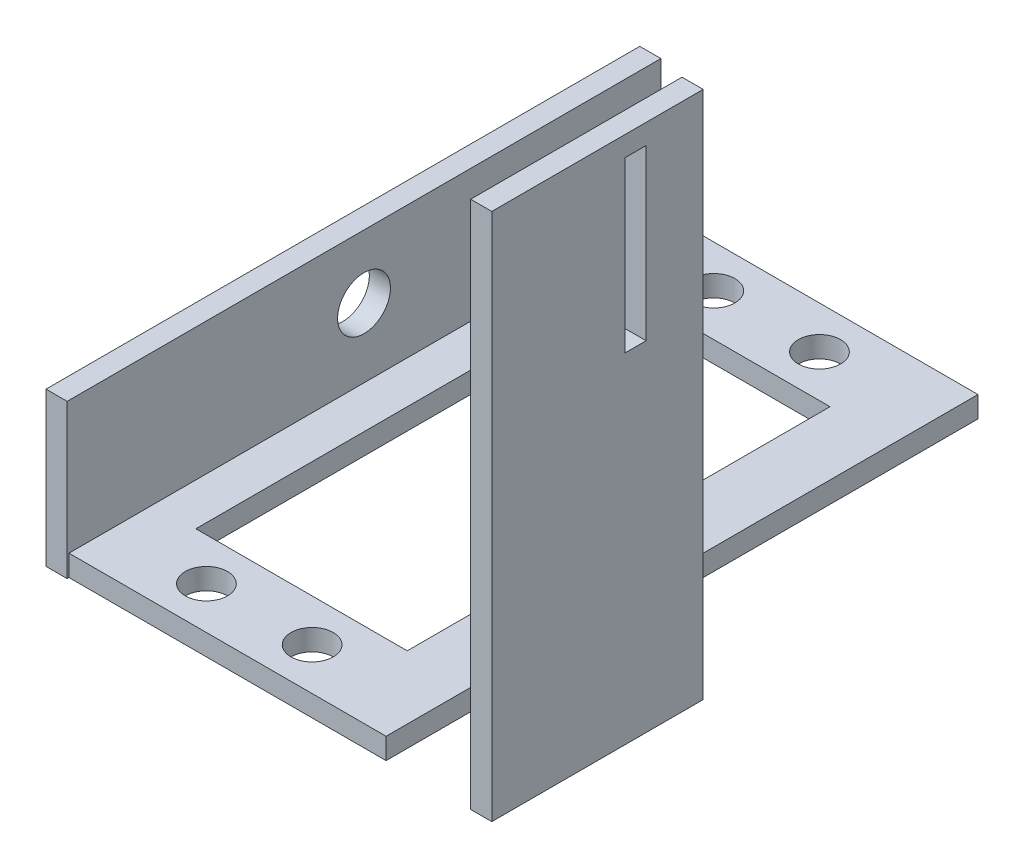
ISO-10303-21;
HEADER;
FILE_DESCRIPTION(('STEP AP214'),'2;1');
FILE_NAME('part.step','',(''),(''),'','','');
FILE_SCHEMA(('AUTOMOTIVE_DESIGN { 1 0 10303 214 1 1 1 1 }'));
ENDSEC;
DATA;
#1=APPLICATION_CONTEXT('core data for automotive mechanical design processes');
#2=APPLICATION_PROTOCOL_DEFINITION('international standard','automotive_design',2000,#1);
#3=PRODUCT_CONTEXT('',#1,'mechanical');
#4=PRODUCT('Part','Part','',(#3));
#5=PRODUCT_RELATED_PRODUCT_CATEGORY('part','',(#4));
#6=PRODUCT_DEFINITION_FORMATION('','',#4);
#7=PRODUCT_DEFINITION_CONTEXT('part definition',#1,'design');
#8=PRODUCT_DEFINITION('design','',#6,#7);
#9=PRODUCT_DEFINITION_SHAPE('','',#8);
#10=(LENGTH_UNIT() NAMED_UNIT(*) SI_UNIT(.MILLI.,.METRE.));
#11=(NAMED_UNIT(*) PLANE_ANGLE_UNIT() SI_UNIT($,.RADIAN.));
#12=(NAMED_UNIT(*) SI_UNIT($,.STERADIAN.) SOLID_ANGLE_UNIT());
#13=UNCERTAINTY_MEASURE_WITH_UNIT(LENGTH_MEASURE(1.E-05),#10,'distance_accuracy_value','');
#14=(GEOMETRIC_REPRESENTATION_CONTEXT(3) GLOBAL_UNCERTAINTY_ASSIGNED_CONTEXT((#13)) GLOBAL_UNIT_ASSIGNED_CONTEXT((#10,
#11,#12)) REPRESENTATION_CONTEXT('',''));
#15=CARTESIAN_POINT('',(0.,0.,0.));
#16=DIRECTION('',(0.,0.,1.));
#17=DIRECTION('',(1.,0.,0.));
#18=AXIS2_PLACEMENT_3D('',#15,#16,#17);
#19=CARTESIAN_POINT('',(15.6140938336516,0.,0.));
#20=DIRECTION('',(1.,0.,0.));
#21=DIRECTION('',(0.,0.,-1.));
#22=AXIS2_PLACEMENT_3D('',#19,#20,#21);
#23=PLANE('',#22);
#24=DIRECTION('',(0.,-1.,0.));
#25=VECTOR('',#24,1.);
#26=CARTESIAN_POINT('',(15.6140938336516,42.,11.5013167120157));
#27=LINE('',#26,#25);
#28=CARTESIAN_POINT('',(15.6140938336516,2.,11.5013167120157));
#29=VERTEX_POINT('',#28);
#30=CARTESIAN_POINT('',(15.6140938336516,0.,11.5013167120157));
#31=VERTEX_POINT('',#30);
#32=EDGE_CURVE('E11',#29,#31,#27,.T.);
#33=ORIENTED_EDGE('',*,*,#32,.F.);
#34=DIRECTION('',(0.,0.,1.));
#35=VECTOR('',#34,1.);
#36=CARTESIAN_POINT('',(15.6140938336516,2.,19.5013167120157));
#37=LINE('',#36,#35);
#38=CARTESIAN_POINT('',(15.6140938336516,2.,19.5013167120157));
#39=VERTEX_POINT('',#38);
#40=EDGE_CURVE('E347',#29,#39,#37,.T.);
#41=ORIENTED_EDGE('',*,*,#40,.T.);
#42=DIRECTION('',(0.,-1.,0.));
#43=VECTOR('',#42,1.);
#44=CARTESIAN_POINT('',(15.6140938336516,2.,19.5013167120157));
#45=LINE('',#44,#43);
#46=CARTESIAN_POINT('',(15.6140938336516,0.,19.5013167120157));
#47=VERTEX_POINT('',#46);
#48=EDGE_CURVE('E338',#39,#47,#45,.T.);
#49=ORIENTED_EDGE('',*,*,#48,.T.);
#50=DIRECTION('',(0.,0.,-1.));
#51=VECTOR('',#50,1.);
#52=CARTESIAN_POINT('',(15.6140938336516,0.,19.5013167120157));
#53=LINE('',#52,#51);
#54=EDGE_CURVE('E342',#47,#31,#53,.T.);
#55=ORIENTED_EDGE('',*,*,#54,.T.);
#56=EDGE_LOOP('',(#33,#41,#49,#55));
#57=FACE_BOUND('',#56,.T.);
#58=ADVANCED_FACE('F32',(#57),#23,.T.);
#59=CARTESIAN_POINT('',(9.61409383365159,0.,0.));
#60=DIRECTION('',(1.,0.,0.));
#61=DIRECTION('',(0.,0.,-1.));
#62=AXIS2_PLACEMENT_3D('',#59,#60,#61);
#63=PLANE('',#62);
#64=DIRECTION('',(0.,-1.,0.));
#65=VECTOR('',#64,1.);
#66=CARTESIAN_POINT('',(9.61409383365159,2.,-28.4986832879843));
#67=LINE('',#66,#65);
#68=CARTESIAN_POINT('',(9.61409383365159,2.,-28.4986832879843));
#69=VERTEX_POINT('',#68);
#70=CARTESIAN_POINT('',(9.61409383365159,0.,-28.4986832879843));
#71=VERTEX_POINT('',#70);
#72=EDGE_CURVE('E330',#69,#71,#67,.T.);
#73=ORIENTED_EDGE('',*,*,#72,.T.);
#74=DIRECTION('',(0.,0.,-1.));
#75=VECTOR('',#74,1.);
#76=CARTESIAN_POINT('',(9.61409383365159,0.,19.5013167120157));
#77=LINE('',#76,#75);
#78=CARTESIAN_POINT('',(9.61409383365159,0.,11.5013167120157));
#79=VERTEX_POINT('',#78);
#80=EDGE_CURVE('E337',#79,#71,#77,.T.);
#81=ORIENTED_EDGE('',*,*,#80,.F.);
#82=DIRECTION('',(0.,-1.,0.));
#83=VECTOR('',#82,1.);
#84=CARTESIAN_POINT('',(9.61409383365159,2.,11.5013167120157));
#85=LINE('',#84,#83);
#86=CARTESIAN_POINT('',(9.61409383365159,2.,11.5013167120157));
#87=VERTEX_POINT('',#86);
#88=EDGE_CURVE('E374',#87,#79,#85,.T.);
#89=ORIENTED_EDGE('',*,*,#88,.F.);
#90=DIRECTION('',(0.,0.,1.));
#91=VECTOR('',#90,1.);
#92=CARTESIAN_POINT('',(9.61409383365159,2.,19.5013167120157));
#93=LINE('',#92,#91);
#94=EDGE_CURVE('E291',#69,#87,#93,.T.);
#95=ORIENTED_EDGE('',*,*,#94,.F.);
#96=EDGE_LOOP('',(#73,#81,#89,#95));
#97=FACE_BOUND('',#96,.T.);
#98=ADVANCED_FACE('F399',(#97),#63,.F.);
#99=CARTESIAN_POINT('',(0.,2.,0.));
#100=DIRECTION('',(0.,1.,0.));
#101=DIRECTION('',(0.,0.,1.));
#102=AXIS2_PLACEMENT_3D('',#99,#100,#101);
#103=PLANE('',#102);
#104=DIRECTION('',(0.,0.,-1.));
#105=VECTOR('',#104,1.);
#106=CARTESIAN_POINT('',(-14.3859061663484,2.,-36.4986832879843));
#107=LINE('',#106,#105);
#108=CARTESIAN_POINT('',(-14.3859061663484,2.,19.5013167120157));
#109=VERTEX_POINT('',#108);
#110=CARTESIAN_POINT('',(-14.3859061663484,2.,-36.4986832879843));
#111=VERTEX_POINT('',#110);
#112=EDGE_CURVE('E285',#109,#111,#107,.T.);
#113=ORIENTED_EDGE('',*,*,#112,.F.);
#114=DIRECTION('',(1.,0.,0.));
#115=VECTOR('',#114,1.);
#116=CARTESIAN_POINT('',(-10.3859061663484,2.,19.5013167120157));
#117=LINE('',#116,#115);
#118=EDGE_CURVE('E367',#109,#39,#117,.T.);
#119=ORIENTED_EDGE('',*,*,#118,.T.);
#120=ORIENTED_EDGE('',*,*,#40,.F.);
#121=CARTESIAN_POINT('',(15.6140938336516,2.,-8.4986832879843));
#122=VERTEX_POINT('',#121);
#123=EDGE_CURVE('E349',#122,#29,#37,.T.);
#124=ORIENTED_EDGE('',*,*,#123,.F.);
#125=CARTESIAN_POINT('',(15.6140938336516,2.,-36.4986832879843));
#126=VERTEX_POINT('',#125);
#127=EDGE_CURVE('E297',#126,#122,#37,.T.);
#128=ORIENTED_EDGE('',*,*,#127,.F.);
#129=DIRECTION('',(-1.,0.,0.));
#130=VECTOR('',#129,1.);
#131=CARTESIAN_POINT('',(15.6140938336516,2.,-36.4986832879843));
#132=LINE('',#131,#130);
#133=EDGE_CURVE('E294',#126,#111,#132,.T.);
#134=ORIENTED_EDGE('',*,*,#133,.T.);
#135=EDGE_LOOP('',(#113,#119,#120,#124,#128,#134));
#136=FACE_BOUND('',#135,.T.);
#137=CARTESIAN_POINT('',(4.61409383365159,2.,15.5013167120157));
#138=DIRECTION('',(0.,1.,0.));
#139=DIRECTION('',(0.,0.,1.));
#140=AXIS2_PLACEMENT_3D('',#137,#138,#139);
#141=CIRCLE('',#140,2.);
#142=CARTESIAN_POINT('',(4.61409383365159,2.,17.5013167120157));
#143=VERTEX_POINT('',#142);
#144=EDGE_CURVE('E303',#143,#143,#141,.T.);
#145=ORIENTED_EDGE('',*,*,#144,.F.);
#146=EDGE_LOOP('',(#145));
#147=FACE_BOUND('',#146,.T.);
#148=DIRECTION('',(-1.,0.,0.));
#149=VECTOR('',#148,1.);
#150=CARTESIAN_POINT('',(-10.3859061663484,2.,11.5013167120157));
#151=LINE('',#150,#149);
#152=CARTESIAN_POINT('',(-10.3859061663484,2.,11.5013167120157));
#153=VERTEX_POINT('',#152);
#154=EDGE_CURVE('E370',#87,#153,#151,.T.);
#155=ORIENTED_EDGE('',*,*,#154,.T.);
#156=DIRECTION('',(0.,0.,-1.));
#157=VECTOR('',#156,1.);
#158=CARTESIAN_POINT('',(-10.3859061663484,2.,-36.4986832879843));
#159=LINE('',#158,#157);
#160=CARTESIAN_POINT('',(-10.3859061663484,2.,-28.4986832879843));
#161=VERTEX_POINT('',#160);
#162=EDGE_CURVE('E306',#153,#161,#159,.T.);
#163=ORIENTED_EDGE('',*,*,#162,.T.);
#164=DIRECTION('',(1.,0.,0.));
#165=VECTOR('',#164,1.);
#166=CARTESIAN_POINT('',(-10.3859061663484,2.,-28.4986832879843));
#167=LINE('',#166,#165);
#168=EDGE_CURVE('E328',#161,#69,#167,.T.);
#169=ORIENTED_EDGE('',*,*,#168,.T.);
#170=ORIENTED_EDGE('',*,*,#94,.T.);
#171=EDGE_LOOP('',(#155,#163,#169,#170));
#172=FACE_BOUND('',#171,.T.);
#173=CARTESIAN_POINT('',(-5.38590616634841,2.,15.5013167120157));
#174=DIRECTION('',(0.,1.,0.));
#175=DIRECTION('',(0.,0.,1.));
#176=AXIS2_PLACEMENT_3D('',#173,#174,#175);
#177=CIRCLE('',#176,2.);
#178=CARTESIAN_POINT('',(-5.38590616634841,2.,17.5013167120157));
#179=VERTEX_POINT('',#178);
#180=EDGE_CURVE('E356',#179,#179,#177,.T.);
#181=ORIENTED_EDGE('',*,*,#180,.F.);
#182=EDGE_LOOP('',(#181));
#183=FACE_BOUND('',#182,.T.);
#184=CARTESIAN_POINT('',(4.61409383365159,2.,-32.4986832879843));
#185=DIRECTION('',(0.,1.,0.));
#186=DIRECTION('',(0.,0.,1.));
#187=AXIS2_PLACEMENT_3D('',#184,#185,#186);
#188=CIRCLE('',#187,2.);
#189=CARTESIAN_POINT('',(4.61409383365159,2.,-30.4986832879843));
#190=VERTEX_POINT('',#189);
#191=EDGE_CURVE('E322',#190,#190,#188,.T.);
#192=ORIENTED_EDGE('',*,*,#191,.F.);
#193=EDGE_LOOP('',(#192));
#194=FACE_BOUND('',#193,.T.);
#195=CARTESIAN_POINT('',(-5.38590616634841,2.,-32.4986832879843));
#196=DIRECTION('',(0.,1.,0.));
#197=DIRECTION('',(0.,0.,1.));
#198=AXIS2_PLACEMENT_3D('',#195,#196,#197);
#199=CIRCLE('',#198,2.);
#200=CARTESIAN_POINT('',(-5.38590616634841,2.,-30.4986832879843));
#201=VERTEX_POINT('',#200);
#202=EDGE_CURVE('E316',#201,#201,#199,.T.);
#203=ORIENTED_EDGE('',*,*,#202,.F.);
#204=EDGE_LOOP('',(#203));
#205=FACE_BOUND('',#204,.T.);
#206=ADVANCED_FACE('F385',(#136,#147,#172,#183,#194,#205),#103,.T.);
#207=CARTESIAN_POINT('',(0.,0.,0.));
#208=DIRECTION('',(0.,1.,0.));
#209=DIRECTION('',(0.,0.,1.));
#210=AXIS2_PLACEMENT_3D('',#207,#208,#209);
#211=PLANE('',#210);
#212=DIRECTION('',(1.,0.,0.));
#213=VECTOR('',#212,1.);
#214=CARTESIAN_POINT('',(-10.3859061663484,0.,19.5013167120157));
#215=LINE('',#214,#213);
#216=CARTESIAN_POINT('',(-14.3859061663484,0.,19.5013167120157));
#217=VERTEX_POINT('',#216);
#218=EDGE_CURVE('E300',#217,#47,#215,.T.);
#219=ORIENTED_EDGE('',*,*,#218,.F.);
#220=DIRECTION('',(0.,0.,1.));
#221=VECTOR('',#220,1.);
#222=CARTESIAN_POINT('',(-14.3859061663484,0.,-36.4986832879843));
#223=LINE('',#222,#221);
#224=CARTESIAN_POINT('',(-14.3859061663484,0.,19.6765111813875));
#225=VERTEX_POINT('',#224);
#226=EDGE_CURVE('E275',#217,#225,#223,.T.);
#227=ORIENTED_EDGE('',*,*,#226,.T.);
#228=DIRECTION('',(1.,0.,0.));
#229=VECTOR('',#228,1.);
#230=CARTESIAN_POINT('',(-16.3859061663484,0.,19.6765111813875));
#231=LINE('',#230,#229);
#232=CARTESIAN_POINT('',(-16.3859061663484,0.,19.6765111813875));
#233=VERTEX_POINT('',#232);
#234=EDGE_CURVE('E276',#233,#225,#231,.T.);
#235=ORIENTED_EDGE('',*,*,#234,.F.);
#236=DIRECTION('',(0.,0.,1.));
#237=VECTOR('',#236,1.);
#238=CARTESIAN_POINT('',(-16.3859061663484,0.,-36.4986832879843));
#239=LINE('',#238,#237);
#240=CARTESIAN_POINT('',(-16.3859061663484,0.,-36.4986832879843));
#241=VERTEX_POINT('',#240);
#242=EDGE_CURVE('E259',#241,#233,#239,.T.);
#243=ORIENTED_EDGE('',*,*,#242,.F.);
#244=DIRECTION('',(-1.,0.,0.));
#245=VECTOR('',#244,1.);
#246=CARTESIAN_POINT('',(15.6140938336516,0.,-36.4986832879843));
#247=LINE('',#246,#245);
#248=CARTESIAN_POINT('',(15.6140938336516,0.,-36.4986832879843));
#249=VERTEX_POINT('',#248);
#250=EDGE_CURVE('E296',#249,#241,#247,.T.);
#251=ORIENTED_EDGE('',*,*,#250,.F.);
#252=CARTESIAN_POINT('',(15.6140938336516,0.,-8.4986832879843));
#253=VERTEX_POINT('',#252);
#254=EDGE_CURVE('E341',#253,#249,#53,.T.);
#255=ORIENTED_EDGE('',*,*,#254,.F.);
#256=EDGE_CURVE('E345',#31,#253,#53,.T.);
#257=ORIENTED_EDGE('',*,*,#256,.F.);
#258=ORIENTED_EDGE('',*,*,#54,.F.);
#259=EDGE_LOOP('',(#219,#227,#235,#243,#251,#255,#257,#258));
#260=FACE_BOUND('',#259,.T.);
#261=DIRECTION('',(0.,0.,1.));
#262=VECTOR('',#261,1.);
#263=CARTESIAN_POINT('',(-10.3859061663484,0.,-36.4986832879843));
#264=LINE('',#263,#262);
#265=CARTESIAN_POINT('',(-10.3859061663484,0.,-28.4986832879843));
#266=VERTEX_POINT('',#265);
#267=CARTESIAN_POINT('',(-10.3859061663484,0.,11.5013167120157));
#268=VERTEX_POINT('',#267);
#269=EDGE_CURVE('E282',#266,#268,#264,.T.);
#270=ORIENTED_EDGE('',*,*,#269,.T.);
#271=DIRECTION('',(-1.,0.,0.));
#272=VECTOR('',#271,1.);
#273=CARTESIAN_POINT('',(-10.3859061663484,0.,11.5013167120157));
#274=LINE('',#273,#272);
#275=EDGE_CURVE('E302',#79,#268,#274,.T.);
#276=ORIENTED_EDGE('',*,*,#275,.F.);
#277=ORIENTED_EDGE('',*,*,#80,.T.);
#278=DIRECTION('',(1.,0.,0.));
#279=VECTOR('',#278,1.);
#280=CARTESIAN_POINT('',(-10.3859061663484,0.,-28.4986832879843));
#281=LINE('',#280,#279);
#282=EDGE_CURVE('E325',#266,#71,#281,.T.);
#283=ORIENTED_EDGE('',*,*,#282,.F.);
#284=EDGE_LOOP('',(#270,#276,#277,#283));
#285=FACE_BOUND('',#284,.T.);
#286=CARTESIAN_POINT('',(4.61409383365159,0.,15.5013167120157));
#287=DIRECTION('',(0.,1.,0.));
#288=DIRECTION('',(0.,0.,1.));
#289=AXIS2_PLACEMENT_3D('',#286,#287,#288);
#290=CIRCLE('',#289,2.);
#291=CARTESIAN_POINT('',(4.61409383365159,0.,17.5013167120157));
#292=VERTEX_POINT('',#291);
#293=EDGE_CURVE('E359',#292,#292,#290,.T.);
#294=ORIENTED_EDGE('',*,*,#293,.T.);
#295=EDGE_LOOP('',(#294));
#296=FACE_BOUND('',#295,.T.);
#297=CARTESIAN_POINT('',(-5.38590616634841,0.,15.5013167120157));
#298=DIRECTION('',(0.,1.,0.));
#299=DIRECTION('',(0.,0.,1.));
#300=AXIS2_PLACEMENT_3D('',#297,#298,#299);
#301=CIRCLE('',#300,2.);
#302=CARTESIAN_POINT('',(-5.38590616634841,0.,17.5013167120157));
#303=VERTEX_POINT('',#302);
#304=EDGE_CURVE('E360',#303,#303,#301,.T.);
#305=ORIENTED_EDGE('',*,*,#304,.T.);
#306=EDGE_LOOP('',(#305));
#307=FACE_BOUND('',#306,.T.);
#308=CARTESIAN_POINT('',(4.61409383365159,0.,-32.4986832879843));
#309=DIRECTION('',(0.,1.,0.));
#310=DIRECTION('',(0.,0.,1.));
#311=AXIS2_PLACEMENT_3D('',#308,#309,#310);
#312=CIRCLE('',#311,2.);
#313=CARTESIAN_POINT('',(4.61409383365159,0.,-30.4986832879843));
#314=VERTEX_POINT('',#313);
#315=EDGE_CURVE('E319',#314,#314,#312,.T.);
#316=ORIENTED_EDGE('',*,*,#315,.T.);
#317=EDGE_LOOP('',(#316));
#318=FACE_BOUND('',#317,.T.);
#319=CARTESIAN_POINT('',(-5.38590616634841,0.,-32.4986832879843));
#320=DIRECTION('',(0.,1.,0.));
#321=DIRECTION('',(0.,0.,1.));
#322=AXIS2_PLACEMENT_3D('',#319,#320,#321);
#323=CIRCLE('',#322,2.);
#324=CARTESIAN_POINT('',(-5.38590616634841,0.,-30.4986832879843));
#325=VERTEX_POINT('',#324);
#326=EDGE_CURVE('E289',#325,#325,#323,.T.);
#327=ORIENTED_EDGE('',*,*,#326,.T.);
#328=EDGE_LOOP('',(#327));
#329=FACE_BOUND('',#328,.T.);
#330=ADVANCED_FACE('F401',(#260,#285,#296,#307,#318,#329),#211,.F.);
#331=CARTESIAN_POINT('',(-10.3859061663484,2.,19.5013167120157));
#332=DIRECTION('',(0.,0.,-1.));
#333=DIRECTION('',(-1.,0.,0.));
#334=AXIS2_PLACEMENT_3D('',#331,#332,#333);
#335=PLANE('',#334);
#336=ORIENTED_EDGE('',*,*,#218,.T.);
#337=ORIENTED_EDGE('',*,*,#48,.F.);
#338=ORIENTED_EDGE('',*,*,#118,.F.);
#339=DIRECTION('',(0.,1.,0.));
#340=VECTOR('',#339,1.);
#341=CARTESIAN_POINT('',(-14.3859061663484,2.,19.5013167120157));
#342=LINE('',#341,#340);
#343=EDGE_CURVE('E290',#217,#109,#342,.T.);
#344=ORIENTED_EDGE('',*,*,#343,.F.);
#345=EDGE_LOOP('',(#336,#337,#338,#344));
#346=FACE_BOUND('',#345,.T.);
#347=ADVANCED_FACE('F34',(#346),#335,.F.);
#348=CARTESIAN_POINT('',(-10.3859061663484,2.,11.5013167120157));
#349=DIRECTION('',(0.,0.,1.));
#350=DIRECTION('',(1.,0.,0.));
#351=AXIS2_PLACEMENT_3D('',#348,#349,#350);
#352=PLANE('',#351);
#353=ORIENTED_EDGE('',*,*,#275,.T.);
#354=DIRECTION('',(0.,-1.,0.));
#355=VECTOR('',#354,1.);
#356=CARTESIAN_POINT('',(-10.3859061663484,2.,11.5013167120157));
#357=LINE('',#356,#355);
#358=EDGE_CURVE('E371',#153,#268,#357,.T.);
#359=ORIENTED_EDGE('',*,*,#358,.F.);
#360=ORIENTED_EDGE('',*,*,#154,.F.);
#361=ORIENTED_EDGE('',*,*,#88,.T.);
#362=EDGE_LOOP('',(#353,#359,#360,#361));
#363=FACE_BOUND('',#362,.T.);
#364=ADVANCED_FACE('F390',(#363),#352,.F.);
#365=CARTESIAN_POINT('',(4.61409383365159,2.,15.5013167120157));
#366=DIRECTION('',(0.,-1.,0.));
#367=DIRECTION('',(0.,0.,-1.));
#368=AXIS2_PLACEMENT_3D('',#365,#366,#367);
#369=CYLINDRICAL_SURFACE('',#368,2.);
#370=ORIENTED_EDGE('',*,*,#144,.T.);
#371=EDGE_LOOP('',(#370));
#372=FACE_BOUND('',#371,.T.);
#373=ORIENTED_EDGE('',*,*,#293,.F.);
#374=EDGE_LOOP('',(#373));
#375=FACE_BOUND('',#374,.T.);
#376=ADVANCED_FACE('F447',(#372,#375),#369,.F.);
#377=CARTESIAN_POINT('',(-5.38590616634841,2.,15.5013167120157));
#378=DIRECTION('',(0.,-1.,0.));
#379=DIRECTION('',(0.,0.,-1.));
#380=AXIS2_PLACEMENT_3D('',#377,#378,#379);
#381=CYLINDRICAL_SURFACE('',#380,2.);
#382=ORIENTED_EDGE('',*,*,#180,.T.);
#383=EDGE_LOOP('',(#382));
#384=FACE_BOUND('',#383,.T.);
#385=ORIENTED_EDGE('',*,*,#304,.F.);
#386=EDGE_LOOP('',(#385));
#387=FACE_BOUND('',#386,.T.);
#388=ADVANCED_FACE('F441',(#384,#387),#381,.F.);
#389=CARTESIAN_POINT('',(15.6140938336516,2.,-36.4986832879843));
#390=DIRECTION('',(0.,0.,1.));
#391=DIRECTION('',(1.,0.,0.));
#392=AXIS2_PLACEMENT_3D('',#389,#390,#391);
#393=PLANE('',#392);
#394=ORIENTED_EDGE('',*,*,#250,.T.);
#395=DIRECTION('',(0.,-1.,0.));
#396=VECTOR('',#395,1.);
#397=CARTESIAN_POINT('',(-16.3859061663484,0.,-36.4986832879843));
#398=LINE('',#397,#396);
#399=CARTESIAN_POINT('',(-16.3859061663484,14.5283077447971,-36.4986832879843));
#400=VERTEX_POINT('',#399);
#401=EDGE_CURVE('E256',#400,#241,#398,.T.);
#402=ORIENTED_EDGE('',*,*,#401,.F.);
#403=DIRECTION('',(1.,0.,0.));
#404=VECTOR('',#403,1.);
#405=CARTESIAN_POINT('',(-16.3859061663484,14.5283077447971,-36.4986832879843));
#406=LINE('',#405,#404);
#407=CARTESIAN_POINT('',(-14.3859061663484,14.5283077447971,-36.4986832879843));
#408=VERTEX_POINT('',#407);
#409=EDGE_CURVE('E266',#400,#408,#406,.T.);
#410=ORIENTED_EDGE('',*,*,#409,.T.);
#411=DIRECTION('',(0.,-1.,0.));
#412=VECTOR('',#411,1.);
#413=CARTESIAN_POINT('',(-14.3859061663484,0.,-36.4986832879843));
#414=LINE('',#413,#412);
#415=EDGE_CURVE('E253',#408,#111,#414,.T.);
#416=ORIENTED_EDGE('',*,*,#415,.T.);
#417=ORIENTED_EDGE('',*,*,#133,.F.);
#418=DIRECTION('',(0.,1.,0.));
#419=VECTOR('',#418,1.);
#420=CARTESIAN_POINT('',(15.6140938336516,2.,-36.4986832879843));
#421=LINE('',#420,#419);
#422=EDGE_CURVE('E344',#249,#126,#421,.T.);
#423=ORIENTED_EDGE('',*,*,#422,.F.);
#424=EDGE_LOOP('',(#394,#402,#410,#416,#417,#423));
#425=FACE_BOUND('',#424,.T.);
#426=ADVANCED_FACE('F436',(#425),#393,.F.);
#427=DIRECTION('',(0.,1.,0.));
#428=VECTOR('',#427,1.);
#429=CARTESIAN_POINT('',(15.6140938336516,42.,-8.4986832879843));
#430=LINE('',#429,#428);
#431=EDGE_CURVE('E41',#253,#122,#430,.T.);
#432=ORIENTED_EDGE('',*,*,#431,.F.);
#433=ORIENTED_EDGE('',*,*,#254,.T.);
#434=ORIENTED_EDGE('',*,*,#422,.T.);
#435=ORIENTED_EDGE('',*,*,#127,.T.);
#436=EDGE_LOOP('',(#432,#433,#434,#435));
#437=FACE_BOUND('',#436,.T.);
#438=ADVANCED_FACE('F429',(#437),#23,.T.);
#439=CARTESIAN_POINT('',(-10.3859061663484,2.,-28.4986832879843));
#440=DIRECTION('',(0.,0.,-1.));
#441=DIRECTION('',(-1.,0.,0.));
#442=AXIS2_PLACEMENT_3D('',#439,#440,#441);
#443=PLANE('',#442);
#444=ORIENTED_EDGE('',*,*,#282,.T.);
#445=ORIENTED_EDGE('',*,*,#72,.F.);
#446=ORIENTED_EDGE('',*,*,#168,.F.);
#447=DIRECTION('',(0.,-1.,0.));
#448=VECTOR('',#447,1.);
#449=CARTESIAN_POINT('',(-10.3859061663484,2.,-28.4986832879843));
#450=LINE('',#449,#448);
#451=EDGE_CURVE('E334',#161,#266,#450,.T.);
#452=ORIENTED_EDGE('',*,*,#451,.T.);
#453=EDGE_LOOP('',(#444,#445,#446,#452));
#454=FACE_BOUND('',#453,.T.);
#455=ADVANCED_FACE('F396',(#454),#443,.F.);
#456=CARTESIAN_POINT('',(4.61409383365159,2.,-32.4986832879843));
#457=DIRECTION('',(0.,-1.,0.));
#458=DIRECTION('',(0.,0.,-1.));
#459=AXIS2_PLACEMENT_3D('',#456,#457,#458);
#460=CYLINDRICAL_SURFACE('',#459,2.);
#461=ORIENTED_EDGE('',*,*,#191,.T.);
#462=EDGE_LOOP('',(#461));
#463=FACE_BOUND('',#462,.T.);
#464=ORIENTED_EDGE('',*,*,#315,.F.);
#465=EDGE_LOOP('',(#464));
#466=FACE_BOUND('',#465,.T.);
#467=ADVANCED_FACE('F416',(#463,#466),#460,.F.);
#468=CARTESIAN_POINT('',(-5.38590616634841,2.,-32.4986832879843));
#469=DIRECTION('',(0.,-1.,0.));
#470=DIRECTION('',(0.,0.,-1.));
#471=AXIS2_PLACEMENT_3D('',#468,#469,#470);
#472=CYLINDRICAL_SURFACE('',#471,2.);
#473=ORIENTED_EDGE('',*,*,#202,.T.);
#474=EDGE_LOOP('',(#473));
#475=FACE_BOUND('',#474,.T.);
#476=ORIENTED_EDGE('',*,*,#326,.F.);
#477=EDGE_LOOP('',(#476));
#478=FACE_BOUND('',#477,.T.);
#479=ADVANCED_FACE('F414',(#475,#478),#472,.F.);
#480=CARTESIAN_POINT('',(-10.3859061663484,0.,0.));
#481=DIRECTION('',(-1.,0.,0.));
#482=DIRECTION('',(0.,0.,1.));
#483=AXIS2_PLACEMENT_3D('',#480,#481,#482);
#484=PLANE('',#483);
#485=ORIENTED_EDGE('',*,*,#162,.F.);
#486=ORIENTED_EDGE('',*,*,#358,.T.);
#487=ORIENTED_EDGE('',*,*,#269,.F.);
#488=ORIENTED_EDGE('',*,*,#451,.F.);
#489=EDGE_LOOP('',(#485,#486,#487,#488));
#490=FACE_BOUND('',#489,.T.);
#491=ADVANCED_FACE('F393',(#490),#484,.F.);
#492=CARTESIAN_POINT('',(-16.3859061663484,0.,19.6765111813875));
#493=DIRECTION('',(0.,0.,-1.));
#494=DIRECTION('',(-1.,0.,0.));
#495=AXIS2_PLACEMENT_3D('',#492,#493,#494);
#496=PLANE('',#495);
#497=DIRECTION('',(0.,1.,0.));
#498=VECTOR('',#497,1.);
#499=CARTESIAN_POINT('',(-14.3859061663484,0.,19.6765111813875));
#500=LINE('',#499,#498);
#501=CARTESIAN_POINT('',(-14.3859061663484,14.5283077447971,19.6765111813875));
#502=VERTEX_POINT('',#501);
#503=EDGE_CURVE('E279',#225,#502,#500,.T.);
#504=ORIENTED_EDGE('',*,*,#503,.T.);
#505=DIRECTION('',(1.,0.,0.));
#506=VECTOR('',#505,1.);
#507=CARTESIAN_POINT('',(-16.3859061663484,14.5283077447971,19.6765111813875));
#508=LINE('',#507,#506);
#509=CARTESIAN_POINT('',(-16.3859061663484,14.5283077447971,19.6765111813875));
#510=VERTEX_POINT('',#509);
#511=EDGE_CURVE('E482',#510,#502,#508,.T.);
#512=ORIENTED_EDGE('',*,*,#511,.F.);
#513=DIRECTION('',(0.,1.,0.));
#514=VECTOR('',#513,1.);
#515=CARTESIAN_POINT('',(-16.3859061663484,0.,19.6765111813875));
#516=LINE('',#515,#514);
#517=EDGE_CURVE('E262',#233,#510,#516,.T.);
#518=ORIENTED_EDGE('',*,*,#517,.F.);
#519=ORIENTED_EDGE('',*,*,#234,.T.);
#520=EDGE_LOOP('',(#504,#512,#518,#519));
#521=FACE_BOUND('',#520,.T.);
#522=ADVANCED_FACE('F423',(#521),#496,.F.);
#523=CARTESIAN_POINT('',(-16.3859061663484,14.5283077447971,-36.4986832879843));
#524=DIRECTION('',(0.,-1.,0.));
#525=DIRECTION('',(0.,0.,-1.));
#526=AXIS2_PLACEMENT_3D('',#523,#524,#525);
#527=PLANE('',#526);
#528=DIRECTION('',(0.,0.,-1.));
#529=VECTOR('',#528,1.);
#530=CARTESIAN_POINT('',(-14.3859061663484,14.5283077447971,-36.4986832879843));
#531=LINE('',#530,#529);
#532=EDGE_CURVE('E260',#502,#408,#531,.T.);
#533=ORIENTED_EDGE('',*,*,#532,.T.);
#534=ORIENTED_EDGE('',*,*,#409,.F.);
#535=DIRECTION('',(0.,0.,-1.));
#536=VECTOR('',#535,1.);
#537=CARTESIAN_POINT('',(-16.3859061663484,14.5283077447971,-36.4986832879843));
#538=LINE('',#537,#536);
#539=EDGE_CURVE('E264',#510,#400,#538,.T.);
#540=ORIENTED_EDGE('',*,*,#539,.F.);
#541=ORIENTED_EDGE('',*,*,#511,.T.);
#542=EDGE_LOOP('',(#533,#534,#540,#541));
#543=FACE_BOUND('',#542,.T.);
#544=ADVANCED_FACE('F492',(#543),#527,.F.);
#545=CARTESIAN_POINT('',(-16.3859061663484,0.,0.));
#546=DIRECTION('',(1.,0.,0.));
#547=DIRECTION('',(0.,0.,-1.));
#548=AXIS2_PLACEMENT_3D('',#545,#546,#547);
#549=PLANE('',#548);
#550=CARTESIAN_POINT('',(-16.3859061663484,8.52830774479708,-8.41108605329842));
#551=DIRECTION('',(-1.,0.,0.));
#552=DIRECTION('',(0.,0.,1.));
#553=AXIS2_PLACEMENT_3D('',#550,#551,#552);
#554=CIRCLE('',#553,2.5);
#555=CARTESIAN_POINT('',(-16.3859061663484,8.52830774479708,-5.91108605329842));
#556=VERTEX_POINT('',#555);
#557=EDGE_CURVE('E249',#556,#556,#554,.T.);
#558=ORIENTED_EDGE('',*,*,#557,.F.);
#559=EDGE_LOOP('',(#558));
#560=FACE_BOUND('',#559,.T.);
#561=ORIENTED_EDGE('',*,*,#401,.T.);
#562=ORIENTED_EDGE('',*,*,#242,.T.);
#563=ORIENTED_EDGE('',*,*,#517,.T.);
#564=ORIENTED_EDGE('',*,*,#539,.T.);
#565=EDGE_LOOP('',(#561,#562,#563,#564));
#566=FACE_BOUND('',#565,.T.);
#567=ADVANCED_FACE('F494',(#560,#566),#549,.F.);
#568=CARTESIAN_POINT('',(-14.3859061663484,0.,0.));
#569=DIRECTION('',(1.,0.,0.));
#570=DIRECTION('',(0.,0.,-1.));
#571=AXIS2_PLACEMENT_3D('',#568,#569,#570);
#572=PLANE('',#571);
#573=CARTESIAN_POINT('',(-14.3859061663484,8.52830774479708,-8.41108605329842));
#574=DIRECTION('',(-1.,0.,0.));
#575=DIRECTION('',(0.,0.,1.));
#576=AXIS2_PLACEMENT_3D('',#573,#574,#575);
#577=CIRCLE('',#576,2.5);
#578=CARTESIAN_POINT('',(-14.3859061663484,8.52830774479708,-5.91108605329842));
#579=VERTEX_POINT('',#578);
#580=EDGE_CURVE('E250',#579,#579,#577,.T.);
#581=ORIENTED_EDGE('',*,*,#580,.T.);
#582=EDGE_LOOP('',(#581));
#583=FACE_BOUND('',#582,.T.);
#584=ORIENTED_EDGE('',*,*,#226,.F.);
#585=ORIENTED_EDGE('',*,*,#343,.T.);
#586=ORIENTED_EDGE('',*,*,#112,.T.);
#587=ORIENTED_EDGE('',*,*,#415,.F.);
#588=ORIENTED_EDGE('',*,*,#532,.F.);
#589=ORIENTED_EDGE('',*,*,#503,.F.);
#590=EDGE_LOOP('',(#584,#585,#586,#587,#588,#589));
#591=FACE_BOUND('',#590,.T.);
#592=ADVANCED_FACE('F474',(#583,#591),#572,.T.);
#593=CARTESIAN_POINT('',(-14.3859061663484,8.52830774479708,-8.41108605329842));
#594=DIRECTION('',(-1.,0.,0.));
#595=DIRECTION('',(0.,0.,1.));
#596=AXIS2_PLACEMENT_3D('',#593,#594,#595);
#597=CYLINDRICAL_SURFACE('',#596,2.5);
#598=ORIENTED_EDGE('',*,*,#580,.F.);
#599=EDGE_LOOP('',(#598));
#600=FACE_BOUND('',#599,.T.);
#601=ORIENTED_EDGE('',*,*,#557,.T.);
#602=EDGE_LOOP('',(#601));
#603=FACE_BOUND('',#602,.T.);
#604=ADVANCED_FACE('F535',(#600,#603),#597,.F.);
#605=CARTESIAN_POINT('',(15.6140938336516,0.,0.));
#606=DIRECTION('',(1.,0.,0.));
#607=DIRECTION('',(0.,0.,-1.));
#608=AXIS2_PLACEMENT_3D('',#605,#606,#607);
#609=PLANE('',#608);
#610=CARTESIAN_POINT('',(15.6140938336516,-8.,11.5013167120157));
#611=VERTEX_POINT('',#610);
#612=EDGE_CURVE('E44',#31,#611,#27,.T.);
#613=ORIENTED_EDGE('',*,*,#612,.F.);
#614=ORIENTED_EDGE('',*,*,#256,.T.);
#615=CARTESIAN_POINT('',(15.6140938336516,-8.,-8.49868328798431));
#616=VERTEX_POINT('',#615);
#617=EDGE_CURVE('E234',#616,#253,#430,.T.);
#618=ORIENTED_EDGE('',*,*,#617,.F.);
#619=DIRECTION('',(0.,0.,-1.));
#620=VECTOR('',#619,1.);
#621=CARTESIAN_POINT('',(15.6140938336516,-8.,11.5013167120157));
#622=LINE('',#621,#620);
#623=EDGE_CURVE('E231',#611,#616,#622,.T.);
#624=ORIENTED_EDGE('',*,*,#623,.F.);
#625=EDGE_LOOP('',(#613,#614,#618,#624));
#626=FACE_BOUND('',#625,.T.);
#627=ADVANCED_FACE('F499',(#626),#609,.F.);
#628=DIRECTION('',(0.,-1.,0.));
#629=VECTOR('',#628,1.);
#630=CARTESIAN_POINT('',(15.6140938336516,24.102958265325,-1.10225408999043));
#631=LINE('',#630,#629);
#632=CARTESIAN_POINT('',(15.6140938336516,40.102958265325,-1.10225408999043));
#633=VERTEX_POINT('',#632);
#634=CARTESIAN_POINT('',(15.6140938336516,24.102958265325,-1.10225408999043));
#635=VERTEX_POINT('',#634);
#636=EDGE_CURVE('E207',#633,#635,#631,.T.);
#637=ORIENTED_EDGE('',*,*,#636,.T.);
#638=DIRECTION('',(0.,0.,-1.));
#639=VECTOR('',#638,1.);
#640=CARTESIAN_POINT('',(15.6140938336516,24.102958265325,-1.10225408999043));
#641=LINE('',#640,#639);
#642=CARTESIAN_POINT('',(15.6140938336516,24.102958265325,-3.10225408999043));
#643=VERTEX_POINT('',#642);
#644=EDGE_CURVE('E195',#635,#643,#641,.T.);
#645=ORIENTED_EDGE('',*,*,#644,.T.);
#646=DIRECTION('',(0.,1.,0.));
#647=VECTOR('',#646,1.);
#648=CARTESIAN_POINT('',(15.6140938336516,24.102958265325,-3.10225408999043));
#649=LINE('',#648,#647);
#650=CARTESIAN_POINT('',(15.6140938336516,40.102958265325,-3.10225408999043));
#651=VERTEX_POINT('',#650);
#652=EDGE_CURVE('E210',#643,#651,#649,.T.);
#653=ORIENTED_EDGE('',*,*,#652,.T.);
#654=DIRECTION('',(0.,0.,1.));
#655=VECTOR('',#654,1.);
#656=CARTESIAN_POINT('',(15.6140938336516,40.102958265325,-1.10225408999043));
#657=LINE('',#656,#655);
#658=EDGE_CURVE('E189',#651,#633,#657,.T.);
#659=ORIENTED_EDGE('',*,*,#658,.T.);
#660=EDGE_LOOP('',(#637,#645,#653,#659));
#661=FACE_BOUND('',#660,.T.);
#662=CARTESIAN_POINT('',(15.6140938336516,42.,-8.4986832879843));
#663=VERTEX_POINT('',#662);
#664=EDGE_CURVE('E233',#122,#663,#430,.T.);
#665=ORIENTED_EDGE('',*,*,#664,.F.);
#666=ORIENTED_EDGE('',*,*,#123,.T.);
#667=CARTESIAN_POINT('',(15.6140938336516,42.,11.5013167120157));
#668=VERTEX_POINT('',#667);
#669=EDGE_CURVE('E43',#668,#29,#27,.T.);
#670=ORIENTED_EDGE('',*,*,#669,.F.);
#671=DIRECTION('',(0.,0.,1.));
#672=VECTOR('',#671,1.);
#673=CARTESIAN_POINT('',(15.6140938336516,42.,11.5013167120157));
#674=LINE('',#673,#672);
#675=EDGE_CURVE('E223',#663,#668,#674,.T.);
#676=ORIENTED_EDGE('',*,*,#675,.F.);
#677=EDGE_LOOP('',(#665,#666,#670,#676));
#678=FACE_BOUND('',#677,.T.);
#679=ADVANCED_FACE('F517',(#661,#678),#609,.F.);
#680=CARTESIAN_POINT('',(17.6140938336516,0.,0.));
#681=DIRECTION('',(1.,0.,0.));
#682=DIRECTION('',(0.,0.,-1.));
#683=AXIS2_PLACEMENT_3D('',#680,#681,#682);
#684=PLANE('',#683);
#685=DIRECTION('',(0.,-1.,0.));
#686=VECTOR('',#685,1.);
#687=CARTESIAN_POINT('',(17.6140938336516,42.,11.5013167120157));
#688=LINE('',#687,#686);
#689=CARTESIAN_POINT('',(17.6140938336516,42.,11.5013167120157));
#690=VERTEX_POINT('',#689);
#691=CARTESIAN_POINT('',(17.6140938336516,-8.,11.5013167120157));
#692=VERTEX_POINT('',#691);
#693=EDGE_CURVE('E219',#690,#692,#688,.T.);
#694=ORIENTED_EDGE('',*,*,#693,.T.);
#695=DIRECTION('',(0.,0.,-1.));
#696=VECTOR('',#695,1.);
#697=CARTESIAN_POINT('',(17.6140938336516,-8.,11.5013167120157));
#698=LINE('',#697,#696);
#699=CARTESIAN_POINT('',(17.6140938336516,-8.,-8.49868328798431));
#700=VERTEX_POINT('',#699);
#701=EDGE_CURVE('E222',#692,#700,#698,.T.);
#702=ORIENTED_EDGE('',*,*,#701,.T.);
#703=DIRECTION('',(0.,1.,0.));
#704=VECTOR('',#703,1.);
#705=CARTESIAN_POINT('',(17.6140938336516,42.,-8.4986832879843));
#706=LINE('',#705,#704);
#707=CARTESIAN_POINT('',(17.6140938336516,42.,-8.4986832879843));
#708=VERTEX_POINT('',#707);
#709=EDGE_CURVE('E225',#700,#708,#706,.T.);
#710=ORIENTED_EDGE('',*,*,#709,.T.);
#711=DIRECTION('',(0.,0.,1.));
#712=VECTOR('',#711,1.);
#713=CARTESIAN_POINT('',(17.6140938336516,42.,11.5013167120157));
#714=LINE('',#713,#712);
#715=EDGE_CURVE('E227',#708,#690,#714,.T.);
#716=ORIENTED_EDGE('',*,*,#715,.T.);
#717=EDGE_LOOP('',(#694,#702,#710,#716));
#718=FACE_BOUND('',#717,.T.);
#719=DIRECTION('',(0.,0.,-1.));
#720=VECTOR('',#719,1.);
#721=CARTESIAN_POINT('',(17.6140938336516,24.102958265325,-1.10225408999043));
#722=LINE('',#721,#720);
#723=CARTESIAN_POINT('',(17.6140938336516,24.102958265325,-1.10225408999043));
#724=VERTEX_POINT('',#723);
#725=CARTESIAN_POINT('',(17.6140938336516,24.102958265325,-3.10225408999043));
#726=VERTEX_POINT('',#725);
#727=EDGE_CURVE('E188',#724,#726,#722,.T.);
#728=ORIENTED_EDGE('',*,*,#727,.F.);
#729=DIRECTION('',(0.,-1.,0.));
#730=VECTOR('',#729,1.);
#731=CARTESIAN_POINT('',(17.6140938336516,24.102958265325,-1.10225408999043));
#732=LINE('',#731,#730);
#733=CARTESIAN_POINT('',(17.6140938336516,40.102958265325,-1.10225408999043));
#734=VERTEX_POINT('',#733);
#735=EDGE_CURVE('E178',#734,#724,#732,.T.);
#736=ORIENTED_EDGE('',*,*,#735,.F.);
#737=DIRECTION('',(0.,0.,1.));
#738=VECTOR('',#737,1.);
#739=CARTESIAN_POINT('',(17.6140938336516,40.102958265325,-1.10225408999043));
#740=LINE('',#739,#738);
#741=CARTESIAN_POINT('',(17.6140938336516,40.102958265325,-3.10225408999043));
#742=VERTEX_POINT('',#741);
#743=EDGE_CURVE('E203',#742,#734,#740,.T.);
#744=ORIENTED_EDGE('',*,*,#743,.F.);
#745=DIRECTION('',(0.,1.,0.));
#746=VECTOR('',#745,1.);
#747=CARTESIAN_POINT('',(17.6140938336516,24.102958265325,-3.10225408999043));
#748=LINE('',#747,#746);
#749=EDGE_CURVE('E201',#726,#742,#748,.T.);
#750=ORIENTED_EDGE('',*,*,#749,.F.);
#751=EDGE_LOOP('',(#728,#736,#744,#750));
#752=FACE_BOUND('',#751,.T.);
#753=ADVANCED_FACE('F199',(#718,#752),#684,.T.);
#754=CARTESIAN_POINT('',(17.6140938336516,42.,11.5013167120157));
#755=DIRECTION('',(0.,0.,-1.));
#756=DIRECTION('',(0.,1.,0.));
#757=AXIS2_PLACEMENT_3D('',#754,#755,#756);
#758=PLANE('',#757);
#759=ORIENTED_EDGE('',*,*,#669,.T.);
#760=ORIENTED_EDGE('',*,*,#32,.T.);
#761=ORIENTED_EDGE('',*,*,#612,.T.);
#762=DIRECTION('',(-1.,0.,0.));
#763=VECTOR('',#762,1.);
#764=CARTESIAN_POINT('',(17.6140938336516,-8.,11.5013167120157));
#765=LINE('',#764,#763);
#766=EDGE_CURVE('E246',#692,#611,#765,.T.);
#767=ORIENTED_EDGE('',*,*,#766,.F.);
#768=ORIENTED_EDGE('',*,*,#693,.F.);
#769=DIRECTION('',(-1.,0.,0.));
#770=VECTOR('',#769,1.);
#771=CARTESIAN_POINT('',(17.6140938336516,42.,11.5013167120157));
#772=LINE('',#771,#770);
#773=EDGE_CURVE('E228',#690,#668,#772,.T.);
#774=ORIENTED_EDGE('',*,*,#773,.T.);
#775=EDGE_LOOP('',(#759,#760,#761,#767,#768,#774));
#776=FACE_BOUND('',#775,.T.);
#777=ADVANCED_FACE('F511',(#776),#758,.F.);
#778=CARTESIAN_POINT('',(17.6140938336516,-8.,11.5013167120157));
#779=DIRECTION('',(0.,1.,0.));
#780=DIRECTION('',(0.,0.,1.));
#781=AXIS2_PLACEMENT_3D('',#778,#779,#780);
#782=PLANE('',#781);
#783=ORIENTED_EDGE('',*,*,#623,.T.);
#784=DIRECTION('',(-1.,0.,0.));
#785=VECTOR('',#784,1.);
#786=CARTESIAN_POINT('',(17.6140938336516,-8.,-8.49868328798431));
#787=LINE('',#786,#785);
#788=EDGE_CURVE('E243',#700,#616,#787,.T.);
#789=ORIENTED_EDGE('',*,*,#788,.F.);
#790=ORIENTED_EDGE('',*,*,#701,.F.);
#791=ORIENTED_EDGE('',*,*,#766,.T.);
#792=EDGE_LOOP('',(#783,#789,#790,#791));
#793=FACE_BOUND('',#792,.T.);
#794=ADVANCED_FACE('F507',(#793),#782,.F.);
#795=CARTESIAN_POINT('',(17.6140938336516,42.,-8.4986832879843));
#796=DIRECTION('',(0.,0.,1.));
#797=DIRECTION('',(0.,-1.,0.));
#798=AXIS2_PLACEMENT_3D('',#795,#796,#797);
#799=PLANE('',#798);
#800=ORIENTED_EDGE('',*,*,#617,.T.);
#801=ORIENTED_EDGE('',*,*,#431,.T.);
#802=ORIENTED_EDGE('',*,*,#664,.T.);
#803=DIRECTION('',(-1.,0.,0.));
#804=VECTOR('',#803,1.);
#805=CARTESIAN_POINT('',(17.6140938336516,42.,-8.4986832879843));
#806=LINE('',#805,#804);
#807=EDGE_CURVE('E240',#708,#663,#806,.T.);
#808=ORIENTED_EDGE('',*,*,#807,.F.);
#809=ORIENTED_EDGE('',*,*,#709,.F.);
#810=ORIENTED_EDGE('',*,*,#788,.T.);
#811=EDGE_LOOP('',(#800,#801,#802,#808,#809,#810));
#812=FACE_BOUND('',#811,.T.);
#813=ADVANCED_FACE('F502',(#812),#799,.F.);
#814=CARTESIAN_POINT('',(17.6140938336516,42.,11.5013167120157));
#815=DIRECTION('',(0.,-1.,0.));
#816=DIRECTION('',(0.,0.,-1.));
#817=AXIS2_PLACEMENT_3D('',#814,#815,#816);
#818=PLANE('',#817);
#819=ORIENTED_EDGE('',*,*,#675,.T.);
#820=ORIENTED_EDGE('',*,*,#773,.F.);
#821=ORIENTED_EDGE('',*,*,#715,.F.);
#822=ORIENTED_EDGE('',*,*,#807,.T.);
#823=EDGE_LOOP('',(#819,#820,#821,#822));
#824=FACE_BOUND('',#823,.T.);
#825=ADVANCED_FACE('F520',(#824),#818,.F.);
#826=CARTESIAN_POINT('',(17.6140938336516,24.102958265325,-1.10225408999043));
#827=DIRECTION('',(0.,0.,-1.));
#828=DIRECTION('',(-1.,0.,0.));
#829=AXIS2_PLACEMENT_3D('',#826,#827,#828);
#830=PLANE('',#829);
#831=ORIENTED_EDGE('',*,*,#636,.F.);
#832=DIRECTION('',(-1.,0.,0.));
#833=VECTOR('',#832,1.);
#834=CARTESIAN_POINT('',(17.6140938336516,40.102958265325,-1.10225408999043));
#835=LINE('',#834,#833);
#836=EDGE_CURVE('E184',#734,#633,#835,.T.);
#837=ORIENTED_EDGE('',*,*,#836,.F.);
#838=ORIENTED_EDGE('',*,*,#735,.T.);
#839=DIRECTION('',(-1.,0.,0.));
#840=VECTOR('',#839,1.);
#841=CARTESIAN_POINT('',(17.6140938336516,24.102958265325,-1.10225408999043));
#842=LINE('',#841,#840);
#843=EDGE_CURVE('E181',#724,#635,#842,.T.);
#844=ORIENTED_EDGE('',*,*,#843,.T.);
#845=EDGE_LOOP('',(#831,#837,#838,#844));
#846=FACE_BOUND('',#845,.T.);
#847=ADVANCED_FACE('F180',(#846),#830,.T.);
#848=CARTESIAN_POINT('',(17.6140938336516,24.102958265325,-1.10225408999043));
#849=DIRECTION('',(0.,1.,0.));
#850=DIRECTION('',(0.,0.,1.));
#851=AXIS2_PLACEMENT_3D('',#848,#849,#850);
#852=PLANE('',#851);
#853=ORIENTED_EDGE('',*,*,#644,.F.);
#854=ORIENTED_EDGE('',*,*,#843,.F.);
#855=ORIENTED_EDGE('',*,*,#727,.T.);
#856=DIRECTION('',(-1.,0.,0.));
#857=VECTOR('',#856,1.);
#858=CARTESIAN_POINT('',(17.6140938336516,24.102958265325,-3.10225408999043));
#859=LINE('',#858,#857);
#860=EDGE_CURVE('E196',#726,#643,#859,.T.);
#861=ORIENTED_EDGE('',*,*,#860,.T.);
#862=EDGE_LOOP('',(#853,#854,#855,#861));
#863=FACE_BOUND('',#862,.T.);
#864=ADVANCED_FACE('F192',(#863),#852,.T.);
#865=CARTESIAN_POINT('',(17.6140938336516,24.102958265325,-3.10225408999043));
#866=DIRECTION('',(0.,0.,1.));
#867=DIRECTION('',(1.,0.,0.));
#868=AXIS2_PLACEMENT_3D('',#865,#866,#867);
#869=PLANE('',#868);
#870=ORIENTED_EDGE('',*,*,#652,.F.);
#871=ORIENTED_EDGE('',*,*,#860,.F.);
#872=ORIENTED_EDGE('',*,*,#749,.T.);
#873=DIRECTION('',(-1.,0.,0.));
#874=VECTOR('',#873,1.);
#875=CARTESIAN_POINT('',(17.6140938336516,40.102958265325,-3.10225408999043));
#876=LINE('',#875,#874);
#877=EDGE_CURVE('E216',#742,#651,#876,.T.);
#878=ORIENTED_EDGE('',*,*,#877,.T.);
#879=EDGE_LOOP('',(#870,#871,#872,#878));
#880=FACE_BOUND('',#879,.T.);
#881=ADVANCED_FACE('F626',(#880),#869,.T.);
#882=CARTESIAN_POINT('',(17.6140938336516,40.102958265325,-1.10225408999043));
#883=DIRECTION('',(0.,-1.,0.));
#884=DIRECTION('',(0.,0.,-1.));
#885=AXIS2_PLACEMENT_3D('',#882,#883,#884);
#886=PLANE('',#885);
#887=ORIENTED_EDGE('',*,*,#658,.F.);
#888=ORIENTED_EDGE('',*,*,#877,.F.);
#889=ORIENTED_EDGE('',*,*,#743,.T.);
#890=ORIENTED_EDGE('',*,*,#836,.T.);
#891=EDGE_LOOP('',(#887,#888,#889,#890));
#892=FACE_BOUND('',#891,.T.);
#893=ADVANCED_FACE('F634',(#892),#886,.T.);
#894=CLOSED_SHELL('',(#58,#98,#206,#330,#347,#364,#376,#388,#426,#438,#455,#467,#479,#491,#522,
#544,#567,#592,#604,#627,#679,#753,#777,#794,#813,#825,#847,#864,#881,#893));
#895=MANIFOLD_SOLID_BREP('B2',#894);
#896=ADVANCED_BREP_SHAPE_REPRESENTATION('',(#18,#895),#14);
#897=SHAPE_DEFINITION_REPRESENTATION(#9,#896);
ENDSEC;
END-ISO-10303-21;
